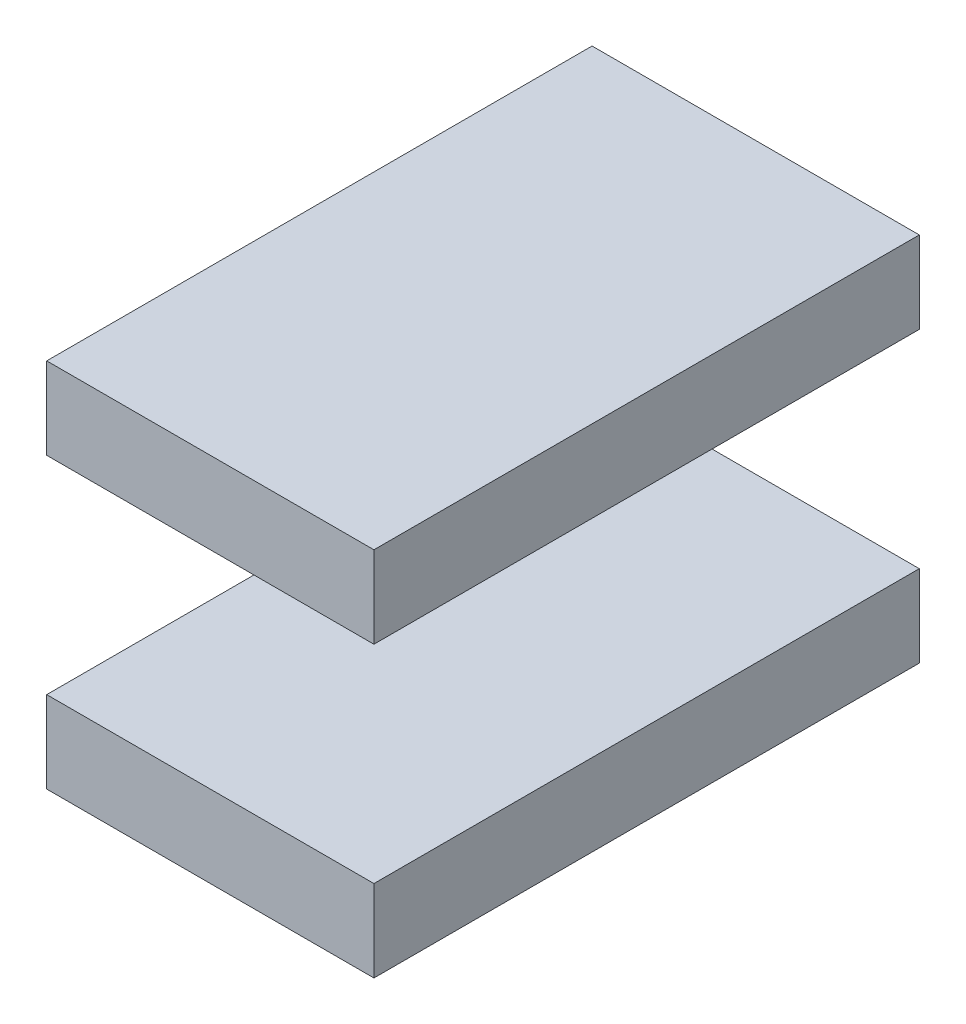
ISO-10303-21;
HEADER;
FILE_DESCRIPTION(('STEP AP214'),'2;1');
FILE_NAME('part.step','',(''),(''),'','','');
FILE_SCHEMA(('AUTOMOTIVE_DESIGN { 1 0 10303 214 1 1 1 1 }'));
ENDSEC;
DATA;
#1=APPLICATION_CONTEXT('core data for automotive mechanical design processes');
#2=APPLICATION_PROTOCOL_DEFINITION('international standard','automotive_design',2000,#1);
#3=PRODUCT_CONTEXT('',#1,'mechanical');
#4=PRODUCT('Part','Part','',(#3));
#5=PRODUCT_RELATED_PRODUCT_CATEGORY('part','',(#4));
#6=PRODUCT_DEFINITION_FORMATION('','',#4);
#7=PRODUCT_DEFINITION_CONTEXT('part definition',#1,'design');
#8=PRODUCT_DEFINITION('design','',#6,#7);
#9=PRODUCT_DEFINITION_SHAPE('','',#8);
#10=(LENGTH_UNIT() NAMED_UNIT(*) SI_UNIT(.MILLI.,.METRE.));
#11=(NAMED_UNIT(*) PLANE_ANGLE_UNIT() SI_UNIT($,.RADIAN.));
#12=(NAMED_UNIT(*) SI_UNIT($,.STERADIAN.) SOLID_ANGLE_UNIT());
#13=UNCERTAINTY_MEASURE_WITH_UNIT(LENGTH_MEASURE(1.E-05),#10,'distance_accuracy_value','');
#14=(GEOMETRIC_REPRESENTATION_CONTEXT(3) GLOBAL_UNCERTAINTY_ASSIGNED_CONTEXT((#13)) GLOBAL_UNIT_ASSIGNED_CONTEXT((#10,
#11,#12)) REPRESENTATION_CONTEXT('',''));
#15=CARTESIAN_POINT('',(0.,0.,0.));
#16=DIRECTION('',(0.,0.,1.));
#17=DIRECTION('',(1.,0.,0.));
#18=AXIS2_PLACEMENT_3D('',#15,#16,#17);
#19=CARTESIAN_POINT('',(74.654210935593,-10.2000000034701,100.));
#20=DIRECTION('',(0.,1.,0.));
#21=DIRECTION('',(0.,0.,1.));
#22=AXIS2_PLACEMENT_3D('',#19,#20,#21);
#23=PLANE('',#22);
#24=DIRECTION('',(1.,0.,0.));
#25=VECTOR('',#24,1.);
#26=CARTESIAN_POINT('',(74.654210935593,-10.2000000034701,0.));
#27=LINE('',#26,#25);
#28=CARTESIAN_POINT('',(74.654210935593,-10.2000000034701,0.));
#29=VERTEX_POINT('',#28);
#30=CARTESIAN_POINT('',(134.654210935593,-10.2000000034701,0.));
#31=VERTEX_POINT('',#30);
#32=EDGE_CURVE('E12',#29,#31,#27,.T.);
#33=ORIENTED_EDGE('',*,*,#32,.T.);
#34=DIRECTION('',(0.,0.,-1.));
#35=VECTOR('',#34,1.);
#36=CARTESIAN_POINT('',(134.654210935593,-10.2000000034701,100.));
#37=LINE('',#36,#35);
#38=CARTESIAN_POINT('',(134.654210935593,-10.2000000034701,100.));
#39=VERTEX_POINT('',#38);
#40=EDGE_CURVE('E124',#39,#31,#37,.T.);
#41=ORIENTED_EDGE('',*,*,#40,.F.);
#42=DIRECTION('',(1.,0.,0.));
#43=VECTOR('',#42,1.);
#44=CARTESIAN_POINT('',(74.654210935593,-10.2000000034701,100.));
#45=LINE('',#44,#43);
#46=CARTESIAN_POINT('',(74.654210935593,-10.2000000034701,100.));
#47=VERTEX_POINT('',#46);
#48=EDGE_CURVE('E57',#47,#39,#45,.T.);
#49=ORIENTED_EDGE('',*,*,#48,.F.);
#50=DIRECTION('',(0.,0.,-1.));
#51=VECTOR('',#50,1.);
#52=CARTESIAN_POINT('',(74.654210935593,-10.2000000034701,100.));
#53=LINE('',#52,#51);
#54=EDGE_CURVE('E112',#47,#29,#53,.T.);
#55=ORIENTED_EDGE('',*,*,#54,.T.);
#56=EDGE_LOOP('',(#33,#41,#49,#55));
#57=FACE_BOUND('',#56,.T.);
#58=ADVANCED_FACE('F53',(#57),#23,.F.);
#59=CARTESIAN_POINT('',(134.654210935593,-10.2000000034701,100.));
#60=DIRECTION('',(-1.,0.,0.));
#61=DIRECTION('',(0.,0.,1.));
#62=AXIS2_PLACEMENT_3D('',#59,#60,#61);
#63=PLANE('',#62);
#64=DIRECTION('',(0.,1.,0.));
#65=VECTOR('',#64,1.);
#66=CARTESIAN_POINT('',(134.654210935593,-10.2000000034701,0.));
#67=LINE('',#66,#65);
#68=CARTESIAN_POINT('',(134.654210935593,4.79999999652992,0.));
#69=VERTEX_POINT('',#68);
#70=EDGE_CURVE('E63',#31,#69,#67,.T.);
#71=ORIENTED_EDGE('',*,*,#70,.T.);
#72=DIRECTION('',(0.,0.,-1.));
#73=VECTOR('',#72,1.);
#74=CARTESIAN_POINT('',(134.654210935593,4.79999999652992,100.));
#75=LINE('',#74,#73);
#76=CARTESIAN_POINT('',(134.654210935593,4.79999999652992,100.));
#77=VERTEX_POINT('',#76);
#78=EDGE_CURVE('E108',#77,#69,#75,.T.);
#79=ORIENTED_EDGE('',*,*,#78,.F.);
#80=DIRECTION('',(0.,1.,0.));
#81=VECTOR('',#80,1.);
#82=CARTESIAN_POINT('',(134.654210935593,-10.2000000034701,100.));
#83=LINE('',#82,#81);
#84=EDGE_CURVE('E87',#39,#77,#83,.T.);
#85=ORIENTED_EDGE('',*,*,#84,.F.);
#86=ORIENTED_EDGE('',*,*,#40,.T.);
#87=EDGE_LOOP('',(#71,#79,#85,#86));
#88=FACE_BOUND('',#87,.T.);
#89=ADVANCED_FACE('F127',(#88),#63,.F.);
#90=CARTESIAN_POINT('',(74.654210935593,4.79999999652992,100.));
#91=DIRECTION('',(0.,-1.,0.));
#92=DIRECTION('',(0.,0.,-1.));
#93=AXIS2_PLACEMENT_3D('',#90,#91,#92);
#94=PLANE('',#93);
#95=DIRECTION('',(-1.,0.,0.));
#96=VECTOR('',#95,1.);
#97=CARTESIAN_POINT('',(74.654210935593,4.79999999652992,0.));
#98=LINE('',#97,#96);
#99=CARTESIAN_POINT('',(74.654210935593,4.79999999652992,0.));
#100=VERTEX_POINT('',#99);
#101=EDGE_CURVE('E103',#69,#100,#98,.T.);
#102=ORIENTED_EDGE('',*,*,#101,.T.);
#103=DIRECTION('',(0.,0.,-1.));
#104=VECTOR('',#103,1.);
#105=CARTESIAN_POINT('',(74.654210935593,4.79999999652992,100.));
#106=LINE('',#105,#104);
#107=CARTESIAN_POINT('',(74.654210935593,4.79999999652992,100.));
#108=VERTEX_POINT('',#107);
#109=EDGE_CURVE('E106',#108,#100,#106,.T.);
#110=ORIENTED_EDGE('',*,*,#109,.F.);
#111=DIRECTION('',(-1.,0.,0.));
#112=VECTOR('',#111,1.);
#113=CARTESIAN_POINT('',(74.654210935593,4.79999999652992,100.));
#114=LINE('',#113,#112);
#115=EDGE_CURVE('E120',#77,#108,#114,.T.);
#116=ORIENTED_EDGE('',*,*,#115,.F.);
#117=ORIENTED_EDGE('',*,*,#78,.T.);
#118=EDGE_LOOP('',(#102,#110,#116,#117));
#119=FACE_BOUND('',#118,.T.);
#120=ADVANCED_FACE('F104',(#119),#94,.F.);
#121=CARTESIAN_POINT('',(74.654210935593,-10.2000000034701,100.));
#122=DIRECTION('',(1.,0.,0.));
#123=DIRECTION('',(0.,1.,0.));
#124=AXIS2_PLACEMENT_3D('',#121,#122,#123);
#125=PLANE('',#124);
#126=DIRECTION('',(0.,-1.,0.));
#127=VECTOR('',#126,1.);
#128=CARTESIAN_POINT('',(74.654210935593,-10.2000000034701,0.));
#129=LINE('',#128,#127);
#130=EDGE_CURVE('E97',#100,#29,#129,.T.);
#131=ORIENTED_EDGE('',*,*,#130,.T.);
#132=ORIENTED_EDGE('',*,*,#54,.F.);
#133=DIRECTION('',(0.,-1.,0.));
#134=VECTOR('',#133,1.);
#135=CARTESIAN_POINT('',(74.654210935593,-10.2000000034701,100.));
#136=LINE('',#135,#134);
#137=EDGE_CURVE('E111',#108,#47,#136,.T.);
#138=ORIENTED_EDGE('',*,*,#137,.F.);
#139=ORIENTED_EDGE('',*,*,#109,.T.);
#140=EDGE_LOOP('',(#131,#132,#138,#139));
#141=FACE_BOUND('',#140,.T.);
#142=ADVANCED_FACE('F110',(#141),#125,.F.);
#143=CARTESIAN_POINT('',(0.,0.,100.));
#144=DIRECTION('',(0.,0.,1.));
#145=DIRECTION('',(1.,0.,0.));
#146=AXIS2_PLACEMENT_3D('',#143,#144,#145);
#147=PLANE('',#146);
#148=ORIENTED_EDGE('',*,*,#48,.T.);
#149=ORIENTED_EDGE('',*,*,#84,.T.);
#150=ORIENTED_EDGE('',*,*,#115,.T.);
#151=ORIENTED_EDGE('',*,*,#137,.T.);
#152=EDGE_LOOP('',(#148,#149,#150,#151));
#153=FACE_BOUND('',#152,.T.);
#154=ADVANCED_FACE('F55',(#153),#147,.T.);
#155=CARTESIAN_POINT('',(0.,0.,0.));
#156=DIRECTION('',(0.,0.,1.));
#157=DIRECTION('',(1.,0.,0.));
#158=AXIS2_PLACEMENT_3D('',#155,#156,#157);
#159=PLANE('',#158);
#160=ORIENTED_EDGE('',*,*,#32,.F.);
#161=ORIENTED_EDGE('',*,*,#130,.F.);
#162=ORIENTED_EDGE('',*,*,#101,.F.);
#163=ORIENTED_EDGE('',*,*,#70,.F.);
#164=EDGE_LOOP('',(#160,#161,#162,#163));
#165=FACE_BOUND('',#164,.T.);
#166=ADVANCED_FACE('F114',(#165),#159,.F.);
#167=CLOSED_SHELL('',(#58,#89,#120,#142,#154,#166));
#168=MANIFOLD_SOLID_BREP('B2',#167);
#169=CARTESIAN_POINT('',(74.654210935593,57.7999999965299,100.));
#170=DIRECTION('',(1.,0.,0.));
#171=DIRECTION('',(0.,1.,0.));
#172=AXIS2_PLACEMENT_3D('',#169,#170,#171);
#173=PLANE('',#172);
#174=DIRECTION('',(0.,-1.,0.));
#175=VECTOR('',#174,1.);
#176=CARTESIAN_POINT('',(74.654210935593,57.7999999965299,0.));
#177=LINE('',#176,#175);
#178=CARTESIAN_POINT('',(74.654210935593,57.7999999965299,0.));
#179=VERTEX_POINT('',#178);
#180=CARTESIAN_POINT('',(74.654210935593,42.7999999965299,0.));
#181=VERTEX_POINT('',#180);
#182=EDGE_CURVE('E252',#179,#181,#177,.T.);
#183=ORIENTED_EDGE('',*,*,#182,.T.);
#184=DIRECTION('',(0.,0.,-1.));
#185=VECTOR('',#184,1.);
#186=CARTESIAN_POINT('',(74.654210935593,42.7999999965299,100.));
#187=LINE('',#186,#185);
#188=CARTESIAN_POINT('',(74.654210935593,42.7999999965299,100.));
#189=VERTEX_POINT('',#188);
#190=EDGE_CURVE('E51',#189,#181,#187,.T.);
#191=ORIENTED_EDGE('',*,*,#190,.F.);
#192=DIRECTION('',(0.,-1.,0.));
#193=VECTOR('',#192,1.);
#194=CARTESIAN_POINT('',(74.654210935593,57.7999999965299,100.));
#195=LINE('',#194,#193);
#196=CARTESIAN_POINT('',(74.654210935593,57.7999999965299,100.));
#197=VERTEX_POINT('',#196);
#198=EDGE_CURVE('E240',#197,#189,#195,.T.);
#199=ORIENTED_EDGE('',*,*,#198,.F.);
#200=DIRECTION('',(0.,0.,-1.));
#201=VECTOR('',#200,1.);
#202=CARTESIAN_POINT('',(74.654210935593,57.7999999965299,100.));
#203=LINE('',#202,#201);
#204=EDGE_CURVE('E248',#197,#179,#203,.T.);
#205=ORIENTED_EDGE('',*,*,#204,.T.);
#206=EDGE_LOOP('',(#183,#191,#199,#205));
#207=FACE_BOUND('',#206,.T.);
#208=ADVANCED_FACE('F189',(#207),#173,.F.);
#209=CARTESIAN_POINT('',(74.654210935593,42.7999999965299,100.));
#210=DIRECTION('',(0.,1.,0.));
#211=DIRECTION('',(0.,0.,1.));
#212=AXIS2_PLACEMENT_3D('',#209,#210,#211);
#213=PLANE('',#212);
#214=DIRECTION('',(1.,0.,0.));
#215=VECTOR('',#214,1.);
#216=CARTESIAN_POINT('',(74.654210935593,42.7999999965299,0.));
#217=LINE('',#216,#215);
#218=CARTESIAN_POINT('',(134.654210935593,42.7999999965299,0.));
#219=VERTEX_POINT('',#218);
#220=EDGE_CURVE('E244',#181,#219,#217,.T.);
#221=ORIENTED_EDGE('',*,*,#220,.T.);
#222=DIRECTION('',(0.,0.,-1.));
#223=VECTOR('',#222,1.);
#224=CARTESIAN_POINT('',(134.654210935593,42.7999999965299,100.));
#225=LINE('',#224,#223);
#226=CARTESIAN_POINT('',(134.654210935593,42.7999999965299,100.));
#227=VERTEX_POINT('',#226);
#228=EDGE_CURVE('E197',#227,#219,#225,.T.);
#229=ORIENTED_EDGE('',*,*,#228,.F.);
#230=DIRECTION('',(1.,0.,0.));
#231=VECTOR('',#230,1.);
#232=CARTESIAN_POINT('',(74.654210935593,42.7999999965299,100.));
#233=LINE('',#232,#231);
#234=EDGE_CURVE('E235',#189,#227,#233,.T.);
#235=ORIENTED_EDGE('',*,*,#234,.F.);
#236=ORIENTED_EDGE('',*,*,#190,.T.);
#237=EDGE_LOOP('',(#221,#229,#235,#236));
#238=FACE_BOUND('',#237,.T.);
#239=ADVANCED_FACE('F243',(#238),#213,.F.);
#240=CARTESIAN_POINT('',(134.654210935593,57.7999999965299,100.));
#241=DIRECTION('',(-1.,0.,0.));
#242=DIRECTION('',(0.,0.,1.));
#243=AXIS2_PLACEMENT_3D('',#240,#241,#242);
#244=PLANE('',#243);
#245=DIRECTION('',(0.,1.,0.));
#246=VECTOR('',#245,1.);
#247=CARTESIAN_POINT('',(134.654210935593,57.7999999965299,0.));
#248=LINE('',#247,#246);
#249=CARTESIAN_POINT('',(134.654210935593,57.7999999965299,0.));
#250=VERTEX_POINT('',#249);
#251=EDGE_CURVE('E222',#219,#250,#248,.T.);
#252=ORIENTED_EDGE('',*,*,#251,.T.);
#253=DIRECTION('',(0.,0.,-1.));
#254=VECTOR('',#253,1.);
#255=CARTESIAN_POINT('',(134.654210935593,57.7999999965299,100.));
#256=LINE('',#255,#254);
#257=CARTESIAN_POINT('',(134.654210935593,57.7999999965299,100.));
#258=VERTEX_POINT('',#257);
#259=EDGE_CURVE('E245',#258,#250,#256,.T.);
#260=ORIENTED_EDGE('',*,*,#259,.F.);
#261=DIRECTION('',(0.,1.,0.));
#262=VECTOR('',#261,1.);
#263=CARTESIAN_POINT('',(134.654210935593,57.7999999965299,100.));
#264=LINE('',#263,#262);
#265=EDGE_CURVE('E238',#227,#258,#264,.T.);
#266=ORIENTED_EDGE('',*,*,#265,.F.);
#267=ORIENTED_EDGE('',*,*,#228,.T.);
#268=EDGE_LOOP('',(#252,#260,#266,#267));
#269=FACE_BOUND('',#268,.T.);
#270=ADVANCED_FACE('F246',(#269),#244,.F.);
#271=CARTESIAN_POINT('',(74.654210935593,57.7999999965299,100.));
#272=DIRECTION('',(0.,-1.,0.));
#273=DIRECTION('',(0.,0.,-1.));
#274=AXIS2_PLACEMENT_3D('',#271,#272,#273);
#275=PLANE('',#274);
#276=DIRECTION('',(-1.,0.,0.));
#277=VECTOR('',#276,1.);
#278=CARTESIAN_POINT('',(74.654210935593,57.7999999965299,0.));
#279=LINE('',#278,#277);
#280=EDGE_CURVE('E228',#250,#179,#279,.T.);
#281=ORIENTED_EDGE('',*,*,#280,.T.);
#282=ORIENTED_EDGE('',*,*,#204,.F.);
#283=DIRECTION('',(-1.,0.,0.));
#284=VECTOR('',#283,1.);
#285=CARTESIAN_POINT('',(74.654210935593,57.7999999965299,100.));
#286=LINE('',#285,#284);
#287=EDGE_CURVE('E205',#258,#197,#286,.T.);
#288=ORIENTED_EDGE('',*,*,#287,.F.);
#289=ORIENTED_EDGE('',*,*,#259,.T.);
#290=EDGE_LOOP('',(#281,#282,#288,#289));
#291=FACE_BOUND('',#290,.T.);
#292=ADVANCED_FACE('F259',(#291),#275,.F.);
#293=CARTESIAN_POINT('',(0.,0.,100.));
#294=DIRECTION('',(0.,0.,1.));
#295=DIRECTION('',(1.,0.,0.));
#296=AXIS2_PLACEMENT_3D('',#293,#294,#295);
#297=PLANE('',#296);
#298=ORIENTED_EDGE('',*,*,#198,.T.);
#299=ORIENTED_EDGE('',*,*,#234,.T.);
#300=ORIENTED_EDGE('',*,*,#265,.T.);
#301=ORIENTED_EDGE('',*,*,#287,.T.);
#302=EDGE_LOOP('',(#298,#299,#300,#301));
#303=FACE_BOUND('',#302,.T.);
#304=ADVANCED_FACE('F236',(#303),#297,.T.);
#305=CARTESIAN_POINT('',(0.,0.,0.));
#306=DIRECTION('',(0.,0.,1.));
#307=DIRECTION('',(1.,0.,0.));
#308=AXIS2_PLACEMENT_3D('',#305,#306,#307);
#309=PLANE('',#308);
#310=ORIENTED_EDGE('',*,*,#182,.F.);
#311=ORIENTED_EDGE('',*,*,#280,.F.);
#312=ORIENTED_EDGE('',*,*,#251,.F.);
#313=ORIENTED_EDGE('',*,*,#220,.F.);
#314=EDGE_LOOP('',(#310,#311,#312,#313));
#315=FACE_BOUND('',#314,.T.);
#316=ADVANCED_FACE('F262',(#315),#309,.F.);
#317=CLOSED_SHELL('',(#208,#239,#270,#292,#304,#316));
#318=MANIFOLD_SOLID_BREP('B6',#317);
#319=ADVANCED_BREP_SHAPE_REPRESENTATION('',(#18,#168,#318),#14);
#320=SHAPE_DEFINITION_REPRESENTATION(#9,#319);
ENDSEC;
END-ISO-10303-21;
